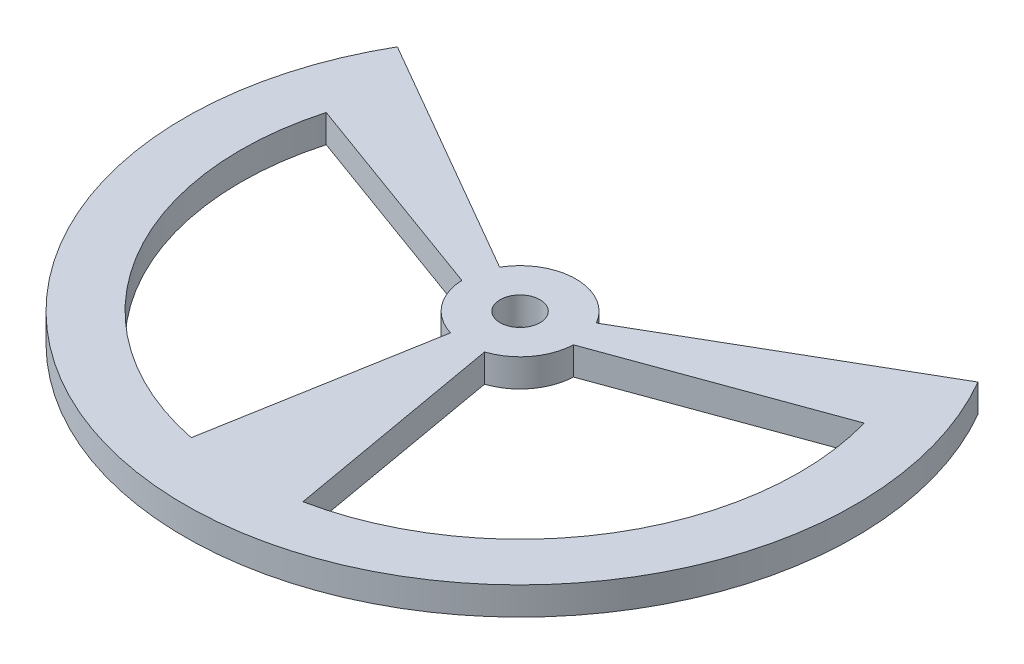
ISO-10303-21;
HEADER;
FILE_DESCRIPTION(('STEP AP214'),'2;1');
FILE_NAME('part.step','',(''),(''),'','','');
FILE_SCHEMA(('AUTOMOTIVE_DESIGN { 1 0 10303 214 1 1 1 1 }'));
ENDSEC;
DATA;
#1=APPLICATION_CONTEXT('core data for automotive mechanical design processes');
#2=APPLICATION_PROTOCOL_DEFINITION('international standard','automotive_design',2000,#1);
#3=PRODUCT_CONTEXT('',#1,'mechanical');
#4=PRODUCT('Part','Part','',(#3));
#5=PRODUCT_RELATED_PRODUCT_CATEGORY('part','',(#4));
#6=PRODUCT_DEFINITION_FORMATION('','',#4);
#7=PRODUCT_DEFINITION_CONTEXT('part definition',#1,'design');
#8=PRODUCT_DEFINITION('design','',#6,#7);
#9=PRODUCT_DEFINITION_SHAPE('','',#8);
#10=(LENGTH_UNIT() NAMED_UNIT(*) SI_UNIT(.MILLI.,.METRE.));
#11=(NAMED_UNIT(*) PLANE_ANGLE_UNIT() SI_UNIT($,.RADIAN.));
#12=(NAMED_UNIT(*) SI_UNIT($,.STERADIAN.) SOLID_ANGLE_UNIT());
#13=UNCERTAINTY_MEASURE_WITH_UNIT(LENGTH_MEASURE(1.E-05),#10,'distance_accuracy_value','');
#14=(GEOMETRIC_REPRESENTATION_CONTEXT(3) GLOBAL_UNCERTAINTY_ASSIGNED_CONTEXT((#13)) GLOBAL_UNIT_ASSIGNED_CONTEXT((#10,
#11,#12)) REPRESENTATION_CONTEXT('',''));
#15=CARTESIAN_POINT('',(0.,0.,0.));
#16=DIRECTION('',(0.,0.,1.));
#17=DIRECTION('',(1.,0.,0.));
#18=AXIS2_PLACEMENT_3D('',#15,#16,#17);
#19=CARTESIAN_POINT('',(0.,12.7,0.));
#20=DIRECTION('',(0.,-1.,0.));
#21=DIRECTION('',(0.,0.,-1.));
#22=AXIS2_PLACEMENT_3D('',#19,#20,#21);
#23=CYLINDRICAL_SURFACE('',#22,152.4);
#24=CARTESIAN_POINT('',(0.,0.,0.));
#25=DIRECTION('',(0.,1.,0.));
#26=DIRECTION('',(0.,0.,-1.));
#27=AXIS2_PLACEMENT_3D('',#24,#25,#26);
#28=CIRCLE('',#27,152.4);
#29=CARTESIAN_POINT('',(-131.982271536748,0.,-76.2));
#30=VERTEX_POINT('',#29);
#31=CARTESIAN_POINT('',(131.982271536747,0.,-76.2000000000028));
#32=VERTEX_POINT('',#31);
#33=EDGE_CURVE('E185',#30,#32,#28,.T.);
#34=ORIENTED_EDGE('',*,*,#33,.T.);
#35=DIRECTION('',(0.,-1.,0.));
#36=VECTOR('',#35,1.);
#37=CARTESIAN_POINT('',(131.982271536747,12.7,-76.2000000000028));
#38=LINE('',#37,#36);
#39=CARTESIAN_POINT('',(131.982271536747,12.7,-76.2000000000028));
#40=VERTEX_POINT('',#39);
#41=EDGE_CURVE('E11',#40,#32,#38,.T.);
#42=ORIENTED_EDGE('',*,*,#41,.F.);
#43=CARTESIAN_POINT('',(0.,12.7,0.));
#44=DIRECTION('',(0.,1.,0.));
#45=DIRECTION('',(0.,0.,-1.));
#46=AXIS2_PLACEMENT_3D('',#43,#44,#45);
#47=CIRCLE('',#46,152.4);
#48=CARTESIAN_POINT('',(-131.982271536748,12.7,-76.2));
#49=VERTEX_POINT('',#48);
#50=EDGE_CURVE('E192',#49,#40,#47,.T.);
#51=ORIENTED_EDGE('',*,*,#50,.F.);
#52=DIRECTION('',(0.,-1.,0.));
#53=VECTOR('',#52,1.);
#54=CARTESIAN_POINT('',(-131.982271536748,12.7,-76.2));
#55=LINE('',#54,#53);
#56=EDGE_CURVE('E202',#49,#30,#55,.T.);
#57=ORIENTED_EDGE('',*,*,#56,.T.);
#58=EDGE_LOOP('',(#34,#42,#51,#57));
#59=FACE_BOUND('',#58,.T.);
#60=ADVANCED_FACE('F31',(#59),#23,.T.);
#61=CARTESIAN_POINT('',(21.9970452561245,12.7,-12.7000000000005));
#62=DIRECTION('',(0.500000000000018,0.,0.866025403784428));
#63=DIRECTION('',(0.866025403784428,0.,-0.500000000000018));
#64=AXIS2_PLACEMENT_3D('',#61,#62,#63);
#65=PLANE('',#64);
#66=DIRECTION('',(-0.866025403784428,0.,0.500000000000018));
#67=VECTOR('',#66,1.);
#68=CARTESIAN_POINT('',(21.9970452561245,0.,-12.7000000000005));
#69=LINE('',#68,#67);
#70=CARTESIAN_POINT('',(21.9970452561245,0.,-12.7000000000005));
#71=VERTEX_POINT('',#70);
#72=EDGE_CURVE('E205',#32,#71,#69,.T.);
#73=ORIENTED_EDGE('',*,*,#72,.T.);
#74=DIRECTION('',(0.,-1.,0.));
#75=VECTOR('',#74,1.);
#76=CARTESIAN_POINT('',(21.9970452561245,12.7,-12.7000000000005));
#77=LINE('',#76,#75);
#78=CARTESIAN_POINT('',(21.9970452561245,12.7,-12.7000000000005));
#79=VERTEX_POINT('',#78);
#80=EDGE_CURVE('E38',#79,#71,#77,.T.);
#81=ORIENTED_EDGE('',*,*,#80,.F.);
#82=DIRECTION('',(-0.866025403784428,0.,0.500000000000018));
#83=VECTOR('',#82,1.);
#84=CARTESIAN_POINT('',(21.9970452561245,12.7,-12.7000000000005));
#85=LINE('',#84,#83);
#86=EDGE_CURVE('E195',#40,#79,#85,.T.);
#87=ORIENTED_EDGE('',*,*,#86,.F.);
#88=ORIENTED_EDGE('',*,*,#41,.T.);
#89=EDGE_LOOP('',(#73,#81,#87,#88));
#90=FACE_BOUND('',#89,.T.);
#91=ADVANCED_FACE('F234',(#90),#65,.F.);
#92=CARTESIAN_POINT('',(0.,12.7,0.));
#93=DIRECTION('',(0.,-1.,0.));
#94=DIRECTION('',(0.,0.,-1.));
#95=AXIS2_PLACEMENT_3D('',#92,#93,#94);
#96=CYLINDRICAL_SURFACE('',#95,25.4);
#97=CARTESIAN_POINT('',(0.,0.,0.));
#98=DIRECTION('',(0.,1.,0.));
#99=DIRECTION('',(0.,0.,-1.));
#100=AXIS2_PLACEMENT_3D('',#97,#98,#99);
#101=CIRCLE('',#100,25.4);
#102=CARTESIAN_POINT('',(-21.9970452561247,0.,-12.7));
#103=VERTEX_POINT('',#102);
#104=EDGE_CURVE('E207',#71,#103,#101,.T.);
#105=ORIENTED_EDGE('',*,*,#104,.T.);
#106=DIRECTION('',(0.,-1.,0.));
#107=VECTOR('',#106,1.);
#108=CARTESIAN_POINT('',(-21.9970452561247,12.7,-12.7));
#109=LINE('',#108,#107);
#110=CARTESIAN_POINT('',(-21.9970452561247,12.7,-12.7));
#111=VERTEX_POINT('',#110);
#112=EDGE_CURVE('E212',#111,#103,#109,.T.);
#113=ORIENTED_EDGE('',*,*,#112,.F.);
#114=CARTESIAN_POINT('',(0.,12.7,0.));
#115=DIRECTION('',(0.,1.,0.));
#116=DIRECTION('',(0.,0.,-1.));
#117=AXIS2_PLACEMENT_3D('',#114,#115,#116);
#118=CIRCLE('',#117,25.4);
#119=EDGE_CURVE('E198',#79,#111,#118,.T.);
#120=ORIENTED_EDGE('',*,*,#119,.F.);
#121=ORIENTED_EDGE('',*,*,#80,.T.);
#122=EDGE_LOOP('',(#105,#113,#120,#121));
#123=FACE_BOUND('',#122,.T.);
#124=ADVANCED_FACE('F219',(#123),#96,.T.);
#125=CARTESIAN_POINT('',(-131.982271536748,12.7,-76.2));
#126=DIRECTION('',(-0.5,0.,0.866025403784439));
#127=DIRECTION('',(0.866025403784439,0.,0.5));
#128=AXIS2_PLACEMENT_3D('',#125,#126,#127);
#129=PLANE('',#128);
#130=DIRECTION('',(-0.866025403784439,0.,-0.5));
#131=VECTOR('',#130,1.);
#132=CARTESIAN_POINT('',(-131.982271536748,0.,-76.2));
#133=LINE('',#132,#131);
#134=EDGE_CURVE('E196',#103,#30,#133,.T.);
#135=ORIENTED_EDGE('',*,*,#134,.T.);
#136=ORIENTED_EDGE('',*,*,#56,.F.);
#137=DIRECTION('',(-0.866025403784439,0.,-0.5));
#138=VECTOR('',#137,1.);
#139=CARTESIAN_POINT('',(-131.982271536748,12.7,-76.2));
#140=LINE('',#139,#138);
#141=EDGE_CURVE('E200',#111,#49,#140,.T.);
#142=ORIENTED_EDGE('',*,*,#141,.F.);
#143=ORIENTED_EDGE('',*,*,#112,.T.);
#144=EDGE_LOOP('',(#135,#136,#142,#143));
#145=FACE_BOUND('',#144,.T.);
#146=ADVANCED_FACE('F227',(#145),#129,.F.);
#147=CARTESIAN_POINT('',(0.,12.7,0.));
#148=DIRECTION('',(0.,-1.,0.));
#149=DIRECTION('',(0.,0.,-1.));
#150=AXIS2_PLACEMENT_3D('',#147,#148,#149);
#151=PLANE('',#150);
#152=CARTESIAN_POINT('',(0.,12.7,0.));
#153=DIRECTION('',(0.,-1.,0.));
#154=DIRECTION('',(0.,0.,-1.));
#155=AXIS2_PLACEMENT_3D('',#152,#153,#154);
#156=CIRCLE('',#155,9.07761973979096);
#157=CARTESIAN_POINT('',(0.,12.7,-9.07761973979096));
#158=VERTEX_POINT('',#157);
#159=EDGE_CURVE('E150',#158,#158,#156,.T.);
#160=ORIENTED_EDGE('',*,*,#159,.T.);
#161=EDGE_LOOP('',(#160));
#162=FACE_BOUND('',#161,.T.);
#163=DIRECTION('',(0.173648177666934,0.,0.984807753012207));
#164=VECTOR('',#163,1.);
#165=CARTESIAN_POINT('',(7.96553258936123,12.7,24.1186709950574));
#166=LINE('',#165,#164);
#167=CARTESIAN_POINT('',(7.96553258936123,12.7,24.1186709950574));
#168=VERTEX_POINT('',#167);
#169=CARTESIAN_POINT('',(25.6449836788916,12.7,124.38382053993));
#170=VERTEX_POINT('',#169);
#171=EDGE_CURVE('E149',#168,#170,#166,.T.);
#172=ORIENTED_EDGE('',*,*,#171,.F.);
#173=CARTESIAN_POINT('',(0.,12.7,0.));
#174=DIRECTION('',(0.,-1.,0.));
#175=DIRECTION('',(0.,0.,1.));
#176=AXIS2_PLACEMENT_3D('',#173,#174,#175);
#177=CIRCLE('',#176,25.4);
#178=CARTESIAN_POINT('',(25.3763249879098,12.7,1.0964169407597));
#179=VERTEX_POINT('',#178);
#180=EDGE_CURVE('E45',#179,#168,#177,.T.);
#181=ORIENTED_EDGE('',*,*,#180,.F.);
#182=DIRECTION('',(-0.939692620785906,0.,0.342020143325675));
#183=VECTOR('',#182,1.);
#184=CARTESIAN_POINT('',(25.3763249879098,12.7,1.0964169407597));
#185=LINE('',#184,#183);
#186=CARTESIAN_POINT('',(122.312523375779,12.7,-34.1854738953488));
#187=VERTEX_POINT('',#186);
#188=EDGE_CURVE('E137',#187,#179,#185,.T.);
#189=ORIENTED_EDGE('',*,*,#188,.F.);
#190=CARTESIAN_POINT('',(0.,12.7,0.));
#191=DIRECTION('',(0.,1.,0.));
#192=DIRECTION('',(0.,0.,1.));
#193=AXIS2_PLACEMENT_3D('',#190,#191,#192);
#194=CIRCLE('',#193,127.);
#195=EDGE_CURVE('E140',#170,#187,#194,.T.);
#196=ORIENTED_EDGE('',*,*,#195,.F.);
#197=EDGE_LOOP('',(#172,#181,#189,#196));
#198=FACE_BOUND('',#197,.T.);
#199=DIRECTION('',(0.173648177666921,0.,-0.98480775301221));
#200=VECTOR('',#199,1.);
#201=CARTESIAN_POINT('',(-24.9581141688324,12.7,124.523461793895));
#202=LINE('',#201,#200);
#203=CARTESIAN_POINT('',(-24.9581141688324,12.7,124.523461793895));
#204=VERTEX_POINT('',#203);
#205=CARTESIAN_POINT('',(-7.29146874002801,12.7,24.3309367598782));
#206=VERTEX_POINT('',#205);
#207=EDGE_CURVE('E175',#204,#206,#202,.T.);
#208=ORIENTED_EDGE('',*,*,#207,.F.);
#209=CARTESIAN_POINT('',(0.,12.7,0.));
#210=DIRECTION('',(0.,1.,0.));
#211=DIRECTION('',(0.,0.,1.));
#212=AXIS2_PLACEMENT_3D('',#209,#210,#211);
#213=CIRCLE('',#212,127.);
#214=CARTESIAN_POINT('',(-122.312523375779,12.7,-34.1854738953475));
#215=VERTEX_POINT('',#214);
#216=EDGE_CURVE('E156',#215,#204,#213,.T.);
#217=ORIENTED_EDGE('',*,*,#216,.F.);
#218=DIRECTION('',(-0.93969262078591,0.,-0.342020143325663));
#219=VECTOR('',#218,1.);
#220=CARTESIAN_POINT('',(-122.312523375779,12.7,-34.1854738953475));
#221=LINE('',#220,#219);
#222=CARTESIAN_POINT('',(-25.3763249879098,12.7,1.0964169407597));
#223=VERTEX_POINT('',#222);
#224=EDGE_CURVE('E164',#223,#215,#221,.T.);
#225=ORIENTED_EDGE('',*,*,#224,.F.);
#226=CARTESIAN_POINT('',(0.,12.7,0.));
#227=DIRECTION('',(0.,-1.,0.));
#228=DIRECTION('',(0.,0.,1.));
#229=AXIS2_PLACEMENT_3D('',#226,#227,#228);
#230=CIRCLE('',#229,25.4);
#231=EDGE_CURVE('E178',#206,#223,#230,.T.);
#232=ORIENTED_EDGE('',*,*,#231,.F.);
#233=EDGE_LOOP('',(#208,#217,#225,#232));
#234=FACE_BOUND('',#233,.T.);
#235=ORIENTED_EDGE('',*,*,#50,.T.);
#236=ORIENTED_EDGE('',*,*,#86,.T.);
#237=ORIENTED_EDGE('',*,*,#119,.T.);
#238=ORIENTED_EDGE('',*,*,#141,.T.);
#239=EDGE_LOOP('',(#235,#236,#237,#238));
#240=FACE_BOUND('',#239,.T.);
#241=ADVANCED_FACE('F233',(#162,#198,#234,#240),#151,.F.);
#242=CARTESIAN_POINT('',(0.,0.,0.));
#243=DIRECTION('',(0.,-1.,0.));
#244=DIRECTION('',(0.,0.,-1.));
#245=AXIS2_PLACEMENT_3D('',#242,#243,#244);
#246=PLANE('',#245);
#247=CARTESIAN_POINT('',(0.,0.,0.));
#248=DIRECTION('',(0.,-1.,0.));
#249=DIRECTION('',(0.,0.,-1.));
#250=AXIS2_PLACEMENT_3D('',#247,#248,#249);
#251=CIRCLE('',#250,9.07761973979096);
#252=CARTESIAN_POINT('',(0.,0.,-9.07761973979096));
#253=VERTEX_POINT('',#252);
#254=EDGE_CURVE('E143',#253,#253,#251,.T.);
#255=ORIENTED_EDGE('',*,*,#254,.F.);
#256=EDGE_LOOP('',(#255));
#257=FACE_BOUND('',#256,.T.);
#258=CARTESIAN_POINT('',(0.,0.,0.));
#259=DIRECTION('',(0.,-1.,0.));
#260=DIRECTION('',(0.,0.,1.));
#261=AXIS2_PLACEMENT_3D('',#258,#259,#260);
#262=CIRCLE('',#261,25.4);
#263=CARTESIAN_POINT('',(25.3763249879098,0.,1.0964169407597));
#264=VERTEX_POINT('',#263);
#265=CARTESIAN_POINT('',(7.96553258936123,0.,24.1186709950574));
#266=VERTEX_POINT('',#265);
#267=EDGE_CURVE('E121',#264,#266,#262,.T.);
#268=ORIENTED_EDGE('',*,*,#267,.T.);
#269=DIRECTION('',(0.173648177666934,0.,0.984807753012207));
#270=VECTOR('',#269,1.);
#271=CARTESIAN_POINT('',(7.96553258936123,0.,24.1186709950574));
#272=LINE('',#271,#270);
#273=CARTESIAN_POINT('',(25.6449836788916,0.,124.38382053993));
#274=VERTEX_POINT('',#273);
#275=EDGE_CURVE('E130',#266,#274,#272,.T.);
#276=ORIENTED_EDGE('',*,*,#275,.T.);
#277=CARTESIAN_POINT('',(0.,0.,0.));
#278=DIRECTION('',(0.,1.,0.));
#279=DIRECTION('',(0.,0.,1.));
#280=AXIS2_PLACEMENT_3D('',#277,#278,#279);
#281=CIRCLE('',#280,127.);
#282=CARTESIAN_POINT('',(122.312523375779,0.,-34.1854738953488));
#283=VERTEX_POINT('',#282);
#284=EDGE_CURVE('E53',#274,#283,#281,.T.);
#285=ORIENTED_EDGE('',*,*,#284,.T.);
#286=DIRECTION('',(-0.939692620785906,0.,0.342020143325675));
#287=VECTOR('',#286,1.);
#288=CARTESIAN_POINT('',(25.3763249879098,0.,1.0964169407597));
#289=LINE('',#288,#287);
#290=EDGE_CURVE('E127',#283,#264,#289,.T.);
#291=ORIENTED_EDGE('',*,*,#290,.T.);
#292=EDGE_LOOP('',(#268,#276,#285,#291));
#293=FACE_BOUND('',#292,.T.);
#294=CARTESIAN_POINT('',(0.,0.,0.));
#295=DIRECTION('',(0.,1.,0.));
#296=DIRECTION('',(0.,0.,1.));
#297=AXIS2_PLACEMENT_3D('',#294,#295,#296);
#298=CIRCLE('',#297,127.);
#299=CARTESIAN_POINT('',(-122.312523375779,0.,-34.1854738953475));
#300=VERTEX_POINT('',#299);
#301=CARTESIAN_POINT('',(-24.9581141688324,0.,124.523461793895));
#302=VERTEX_POINT('',#301);
#303=EDGE_CURVE('E160',#300,#302,#298,.T.);
#304=ORIENTED_EDGE('',*,*,#303,.T.);
#305=DIRECTION('',(0.173648177666921,0.,-0.98480775301221));
#306=VECTOR('',#305,1.);
#307=CARTESIAN_POINT('',(-24.9581141688324,0.,124.523461793895));
#308=LINE('',#307,#306);
#309=CARTESIAN_POINT('',(-7.291468740028,0.,24.3309367598782));
#310=VERTEX_POINT('',#309);
#311=EDGE_CURVE('E163',#302,#310,#308,.T.);
#312=ORIENTED_EDGE('',*,*,#311,.T.);
#313=CARTESIAN_POINT('',(0.,0.,0.));
#314=DIRECTION('',(0.,-1.,0.));
#315=DIRECTION('',(0.,0.,1.));
#316=AXIS2_PLACEMENT_3D('',#313,#314,#315);
#317=CIRCLE('',#316,25.4);
#318=CARTESIAN_POINT('',(-25.3763249879098,0.,1.0964169407597));
#319=VERTEX_POINT('',#318);
#320=EDGE_CURVE('E167',#310,#319,#317,.T.);
#321=ORIENTED_EDGE('',*,*,#320,.T.);
#322=DIRECTION('',(-0.93969262078591,0.,-0.342020143325663));
#323=VECTOR('',#322,1.);
#324=CARTESIAN_POINT('',(-122.312523375779,0.,-34.1854738953475));
#325=LINE('',#324,#323);
#326=EDGE_CURVE('E170',#319,#300,#325,.T.);
#327=ORIENTED_EDGE('',*,*,#326,.T.);
#328=EDGE_LOOP('',(#304,#312,#321,#327));
#329=FACE_BOUND('',#328,.T.);
#330=ORIENTED_EDGE('',*,*,#33,.F.);
#331=ORIENTED_EDGE('',*,*,#134,.F.);
#332=ORIENTED_EDGE('',*,*,#104,.F.);
#333=ORIENTED_EDGE('',*,*,#72,.F.);
#334=EDGE_LOOP('',(#330,#331,#332,#333));
#335=FACE_BOUND('',#334,.T.);
#336=ADVANCED_FACE('F134',(#257,#293,#329,#335),#246,.T.);
#337=CARTESIAN_POINT('',(0.,0.,0.));
#338=DIRECTION('',(0.,1.,0.));
#339=DIRECTION('',(0.,0.,1.));
#340=AXIS2_PLACEMENT_3D('',#337,#338,#339);
#341=CYLINDRICAL_SURFACE('',#340,127.);
#342=ORIENTED_EDGE('',*,*,#216,.T.);
#343=DIRECTION('',(0.,1.,0.));
#344=VECTOR('',#343,1.);
#345=CARTESIAN_POINT('',(-24.9581141688324,0.,124.523461793895));
#346=LINE('',#345,#344);
#347=EDGE_CURVE('E173',#302,#204,#346,.T.);
#348=ORIENTED_EDGE('',*,*,#347,.F.);
#349=ORIENTED_EDGE('',*,*,#303,.F.);
#350=DIRECTION('',(0.,1.,0.));
#351=VECTOR('',#350,1.);
#352=CARTESIAN_POINT('',(-122.312523375779,0.,-34.1854738953475));
#353=LINE('',#352,#351);
#354=EDGE_CURVE('E183',#300,#215,#353,.T.);
#355=ORIENTED_EDGE('',*,*,#354,.T.);
#356=EDGE_LOOP('',(#342,#348,#349,#355));
#357=FACE_BOUND('',#356,.T.);
#358=ADVANCED_FACE('F246',(#357),#341,.F.);
#359=CARTESIAN_POINT('',(-122.312523375779,0.,-34.1854738953475));
#360=DIRECTION('',(0.342020143325663,0.,-0.93969262078591));
#361=DIRECTION('',(-0.939692620785911,0.,-0.342020143325663));
#362=AXIS2_PLACEMENT_3D('',#359,#360,#361);
#363=PLANE('',#362);
#364=ORIENTED_EDGE('',*,*,#224,.T.);
#365=ORIENTED_EDGE('',*,*,#354,.F.);
#366=ORIENTED_EDGE('',*,*,#326,.F.);
#367=DIRECTION('',(0.,1.,0.));
#368=VECTOR('',#367,1.);
#369=CARTESIAN_POINT('',(-25.3763249879098,0.,1.0964169407597));
#370=LINE('',#369,#368);
#371=EDGE_CURVE('E186',#319,#223,#370,.T.);
#372=ORIENTED_EDGE('',*,*,#371,.T.);
#373=EDGE_LOOP('',(#364,#365,#366,#372));
#374=FACE_BOUND('',#373,.T.);
#375=ADVANCED_FACE('F253',(#374),#363,.F.);
#376=CARTESIAN_POINT('',(0.,0.,0.));
#377=DIRECTION('',(0.,1.,0.));
#378=DIRECTION('',(0.,0.,1.));
#379=AXIS2_PLACEMENT_3D('',#376,#377,#378);
#380=CYLINDRICAL_SURFACE('',#379,25.4);
#381=ORIENTED_EDGE('',*,*,#231,.T.);
#382=ORIENTED_EDGE('',*,*,#371,.F.);
#383=ORIENTED_EDGE('',*,*,#320,.F.);
#384=DIRECTION('',(0.,1.,0.));
#385=VECTOR('',#384,1.);
#386=CARTESIAN_POINT('',(-7.29146874002801,0.,24.3309367598782));
#387=LINE('',#386,#385);
#388=EDGE_CURVE('E188',#310,#206,#387,.T.);
#389=ORIENTED_EDGE('',*,*,#388,.T.);
#390=EDGE_LOOP('',(#381,#382,#383,#389));
#391=FACE_BOUND('',#390,.T.);
#392=ADVANCED_FACE('F258',(#391),#380,.T.);
#393=CARTESIAN_POINT('',(-24.9581141688324,0.,124.523461793895));
#394=DIRECTION('',(0.98480775301221,0.,0.173648177666921));
#395=DIRECTION('',(0.173648177666921,0.,-0.98480775301221));
#396=AXIS2_PLACEMENT_3D('',#393,#394,#395);
#397=PLANE('',#396);
#398=ORIENTED_EDGE('',*,*,#207,.T.);
#399=ORIENTED_EDGE('',*,*,#388,.F.);
#400=ORIENTED_EDGE('',*,*,#311,.F.);
#401=ORIENTED_EDGE('',*,*,#347,.T.);
#402=EDGE_LOOP('',(#398,#399,#400,#401));
#403=FACE_BOUND('',#402,.T.);
#404=ADVANCED_FACE('F255',(#403),#397,.F.);
#405=CARTESIAN_POINT('',(0.,0.,0.));
#406=DIRECTION('',(0.,1.,0.));
#407=DIRECTION('',(0.,0.,1.));
#408=AXIS2_PLACEMENT_3D('',#405,#406,#407);
#409=CYLINDRICAL_SURFACE('',#408,25.4);
#410=ORIENTED_EDGE('',*,*,#180,.T.);
#411=DIRECTION('',(0.,1.,0.));
#412=VECTOR('',#411,1.);
#413=CARTESIAN_POINT('',(7.96553258936123,0.,24.1186709950574));
#414=LINE('',#413,#412);
#415=EDGE_CURVE('E117',#266,#168,#414,.T.);
#416=ORIENTED_EDGE('',*,*,#415,.F.);
#417=ORIENTED_EDGE('',*,*,#267,.F.);
#418=DIRECTION('',(0.,1.,0.));
#419=VECTOR('',#418,1.);
#420=CARTESIAN_POINT('',(25.3763249879098,0.,1.0964169407597));
#421=LINE('',#420,#419);
#422=EDGE_CURVE('E154',#264,#179,#421,.T.);
#423=ORIENTED_EDGE('',*,*,#422,.T.);
#424=EDGE_LOOP('',(#410,#416,#417,#423));
#425=FACE_BOUND('',#424,.T.);
#426=ADVANCED_FACE('F119',(#425),#409,.T.);
#427=CARTESIAN_POINT('',(25.3763249879098,0.,1.0964169407597));
#428=DIRECTION('',(-0.342020143325675,0.,-0.939692620785906));
#429=DIRECTION('',(-0.939692620785906,0.,0.342020143325675));
#430=AXIS2_PLACEMENT_3D('',#427,#428,#429);
#431=PLANE('',#430);
#432=ORIENTED_EDGE('',*,*,#188,.T.);
#433=ORIENTED_EDGE('',*,*,#422,.F.);
#434=ORIENTED_EDGE('',*,*,#290,.F.);
#435=DIRECTION('',(0.,1.,0.));
#436=VECTOR('',#435,1.);
#437=CARTESIAN_POINT('',(122.312523375779,0.,-34.1854738953488));
#438=LINE('',#437,#436);
#439=EDGE_CURVE('E157',#283,#187,#438,.T.);
#440=ORIENTED_EDGE('',*,*,#439,.T.);
#441=EDGE_LOOP('',(#432,#433,#434,#440));
#442=FACE_BOUND('',#441,.T.);
#443=ADVANCED_FACE('F268',(#442),#431,.F.);
#444=CARTESIAN_POINT('',(0.,0.,0.));
#445=DIRECTION('',(0.,1.,0.));
#446=DIRECTION('',(0.,0.,1.));
#447=AXIS2_PLACEMENT_3D('',#444,#445,#446);
#448=CYLINDRICAL_SURFACE('',#447,127.);
#449=ORIENTED_EDGE('',*,*,#195,.T.);
#450=ORIENTED_EDGE('',*,*,#439,.F.);
#451=ORIENTED_EDGE('',*,*,#284,.F.);
#452=DIRECTION('',(0.,1.,0.));
#453=VECTOR('',#452,1.);
#454=CARTESIAN_POINT('',(25.6449836788916,0.,124.38382053993));
#455=LINE('',#454,#453);
#456=EDGE_CURVE('E126',#274,#170,#455,.T.);
#457=ORIENTED_EDGE('',*,*,#456,.T.);
#458=EDGE_LOOP('',(#449,#450,#451,#457));
#459=FACE_BOUND('',#458,.T.);
#460=ADVANCED_FACE('F272',(#459),#448,.F.);
#461=CARTESIAN_POINT('',(7.96553258936123,0.,24.1186709950574));
#462=DIRECTION('',(-0.984807753012207,0.,0.173648177666934));
#463=DIRECTION('',(0.173648177666934,0.,0.984807753012208));
#464=AXIS2_PLACEMENT_3D('',#461,#462,#463);
#465=PLANE('',#464);
#466=ORIENTED_EDGE('',*,*,#171,.T.);
#467=ORIENTED_EDGE('',*,*,#456,.F.);
#468=ORIENTED_EDGE('',*,*,#275,.F.);
#469=ORIENTED_EDGE('',*,*,#415,.T.);
#470=EDGE_LOOP('',(#466,#467,#468,#469));
#471=FACE_BOUND('',#470,.T.);
#472=ADVANCED_FACE('F131',(#471),#465,.F.);
#473=CARTESIAN_POINT('',(0.,12.7,0.));
#474=DIRECTION('',(0.,-1.,0.));
#475=DIRECTION('',(0.,0.,-1.));
#476=AXIS2_PLACEMENT_3D('',#473,#474,#475);
#477=CYLINDRICAL_SURFACE('',#476,9.07761973979096);
#478=ORIENTED_EDGE('',*,*,#159,.F.);
#479=EDGE_LOOP('',(#478));
#480=FACE_BOUND('',#479,.T.);
#481=ORIENTED_EDGE('',*,*,#254,.T.);
#482=EDGE_LOOP('',(#481));
#483=FACE_BOUND('',#482,.T.);
#484=ADVANCED_FACE('F271',(#480,#483),#477,.F.);
#485=CLOSED_SHELL('',(#60,#91,#124,#146,#241,#336,#358,#375,#392,#404,#426,#443,#460,#472,#484));
#486=MANIFOLD_SOLID_BREP('B2',#485);
#487=ADVANCED_BREP_SHAPE_REPRESENTATION('',(#18,#486),#14);
#488=SHAPE_DEFINITION_REPRESENTATION(#9,#487);
ENDSEC;
END-ISO-10303-21;
